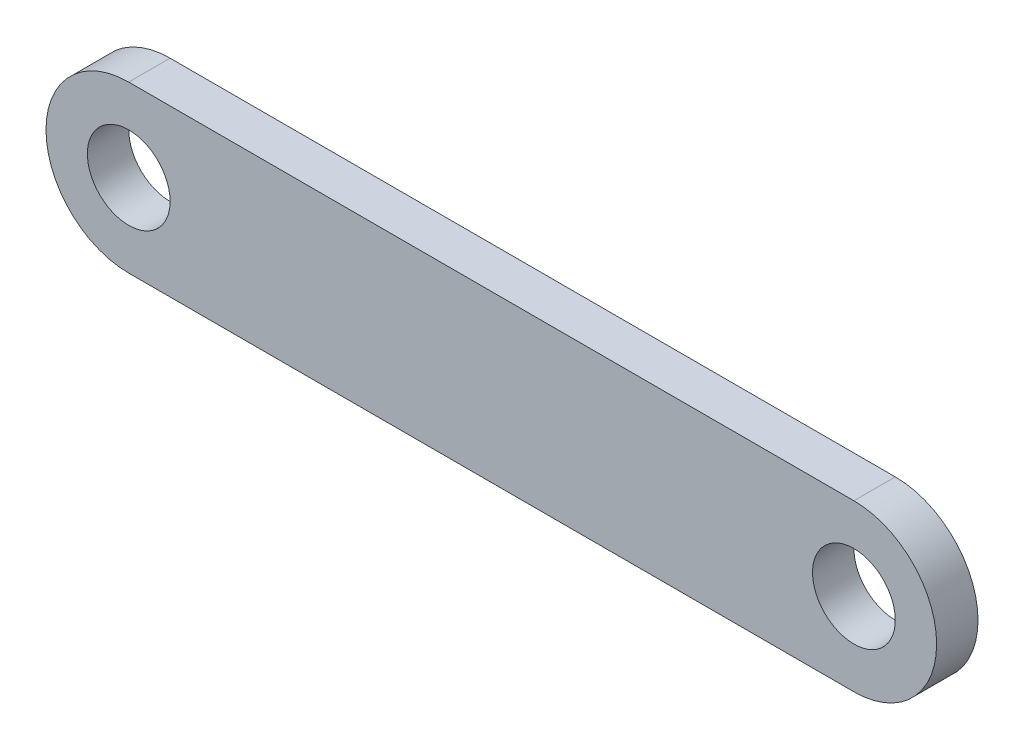
ISO-10303-21;
HEADER;
FILE_DESCRIPTION(('STEP AP214'),'2;1');
FILE_NAME('part.step','',(''),(''),'','','');
FILE_SCHEMA(('AUTOMOTIVE_DESIGN { 1 0 10303 214 1 1 1 1 }'));
ENDSEC;
DATA;
#1=APPLICATION_CONTEXT('core data for automotive mechanical design processes');
#2=APPLICATION_PROTOCOL_DEFINITION('international standard','automotive_design',2000,#1);
#3=PRODUCT_CONTEXT('',#1,'mechanical');
#4=PRODUCT('Part','Part','',(#3));
#5=PRODUCT_RELATED_PRODUCT_CATEGORY('part','',(#4));
#6=PRODUCT_DEFINITION_FORMATION('','',#4);
#7=PRODUCT_DEFINITION_CONTEXT('part definition',#1,'design');
#8=PRODUCT_DEFINITION('design','',#6,#7);
#9=PRODUCT_DEFINITION_SHAPE('','',#8);
#10=(LENGTH_UNIT() NAMED_UNIT(*) SI_UNIT(.MILLI.,.METRE.));
#11=(NAMED_UNIT(*) PLANE_ANGLE_UNIT() SI_UNIT($,.RADIAN.));
#12=(NAMED_UNIT(*) SI_UNIT($,.STERADIAN.) SOLID_ANGLE_UNIT());
#13=UNCERTAINTY_MEASURE_WITH_UNIT(LENGTH_MEASURE(1.E-05),#10,'distance_accuracy_value','');
#14=(GEOMETRIC_REPRESENTATION_CONTEXT(3) GLOBAL_UNCERTAINTY_ASSIGNED_CONTEXT((#13)) GLOBAL_UNIT_ASSIGNED_CONTEXT((#10,
#11,#12)) REPRESENTATION_CONTEXT('',''));
#15=CARTESIAN_POINT('',(0.,0.,0.));
#16=DIRECTION('',(0.,0.,1.));
#17=DIRECTION('',(1.,0.,0.));
#18=AXIS2_PLACEMENT_3D('',#15,#16,#17);
#19=CARTESIAN_POINT('',(0.,-2.,-1.));
#20=DIRECTION('',(0.,-1.,0.));
#21=DIRECTION('',(1.,0.,0.));
#22=AXIS2_PLACEMENT_3D('',#19,#20,#21);
#23=PLANE('',#22);
#24=DIRECTION('',(1.,0.,0.));
#25=VECTOR('',#24,1.);
#26=CARTESIAN_POINT('',(0.,-2.,0.));
#27=LINE('',#26,#25);
#28=CARTESIAN_POINT('',(0.,-2.,0.));
#29=VERTEX_POINT('',#28);
#30=CARTESIAN_POINT('',(17.53,-2.,0.));
#31=VERTEX_POINT('',#30);
#32=EDGE_CURVE('E107',#29,#31,#27,.T.);
#33=ORIENTED_EDGE('',*,*,#32,.F.);
#34=DIRECTION('',(0.,0.,1.));
#35=VECTOR('',#34,1.);
#36=CARTESIAN_POINT('',(0.,-2.,-1.));
#37=LINE('',#36,#35);
#38=CARTESIAN_POINT('',(0.,-2.,-1.));
#39=VERTEX_POINT('',#38);
#40=EDGE_CURVE('E11',#39,#29,#37,.T.);
#41=ORIENTED_EDGE('',*,*,#40,.F.);
#42=DIRECTION('',(1.,0.,0.));
#43=VECTOR('',#42,1.);
#44=CARTESIAN_POINT('',(0.,-2.,-1.));
#45=LINE('',#44,#43);
#46=CARTESIAN_POINT('',(17.53,-2.,-1.));
#47=VERTEX_POINT('',#46);
#48=EDGE_CURVE('E95',#39,#47,#45,.T.);
#49=ORIENTED_EDGE('',*,*,#48,.T.);
#50=DIRECTION('',(0.,0.,1.));
#51=VECTOR('',#50,1.);
#52=CARTESIAN_POINT('',(17.53,-2.,-1.));
#53=LINE('',#52,#51);
#54=EDGE_CURVE('E39',#47,#31,#53,.T.);
#55=ORIENTED_EDGE('',*,*,#54,.T.);
#56=EDGE_LOOP('',(#33,#41,#49,#55));
#57=FACE_BOUND('',#56,.T.);
#58=ADVANCED_FACE('F36',(#57),#23,.T.);
#59=CARTESIAN_POINT('',(0.,0.,-1.));
#60=DIRECTION('',(0.,0.,1.));
#61=DIRECTION('',(1.,0.,0.));
#62=AXIS2_PLACEMENT_3D('',#59,#60,#61);
#63=CYLINDRICAL_SURFACE('',#62,2.);
#64=CARTESIAN_POINT('',(0.,0.,0.));
#65=DIRECTION('',(0.,0.,1.));
#66=DIRECTION('',(1.,0.,0.));
#67=AXIS2_PLACEMENT_3D('',#64,#65,#66);
#68=CIRCLE('',#67,2.);
#69=CARTESIAN_POINT('',(0.,2.,0.));
#70=VERTEX_POINT('',#69);
#71=EDGE_CURVE('E113',#70,#29,#68,.T.);
#72=ORIENTED_EDGE('',*,*,#71,.F.);
#73=DIRECTION('',(0.,0.,1.));
#74=VECTOR('',#73,1.);
#75=CARTESIAN_POINT('',(0.,2.,-1.));
#76=LINE('',#75,#74);
#77=CARTESIAN_POINT('',(0.,2.,-1.));
#78=VERTEX_POINT('',#77);
#79=EDGE_CURVE('E45',#78,#70,#76,.T.);
#80=ORIENTED_EDGE('',*,*,#79,.F.);
#81=CARTESIAN_POINT('',(0.,0.,-1.));
#82=DIRECTION('',(0.,0.,1.));
#83=DIRECTION('',(1.,0.,0.));
#84=AXIS2_PLACEMENT_3D('',#81,#82,#83);
#85=CIRCLE('',#84,2.);
#86=EDGE_CURVE('E88',#78,#39,#85,.T.);
#87=ORIENTED_EDGE('',*,*,#86,.T.);
#88=ORIENTED_EDGE('',*,*,#40,.T.);
#89=EDGE_LOOP('',(#72,#80,#87,#88));
#90=FACE_BOUND('',#89,.T.);
#91=ADVANCED_FACE('F136',(#90),#63,.T.);
#92=CARTESIAN_POINT('',(0.,2.,-1.));
#93=DIRECTION('',(0.,-1.,0.));
#94=DIRECTION('',(1.,0.,0.));
#95=AXIS2_PLACEMENT_3D('',#92,#93,#94);
#96=PLANE('',#95);
#97=DIRECTION('',(1.,0.,0.));
#98=VECTOR('',#97,1.);
#99=CARTESIAN_POINT('',(0.,2.,0.));
#100=LINE('',#99,#98);
#101=CARTESIAN_POINT('',(17.53,2.,0.));
#102=VERTEX_POINT('',#101);
#103=EDGE_CURVE('E92',#70,#102,#100,.T.);
#104=ORIENTED_EDGE('',*,*,#103,.T.);
#105=DIRECTION('',(0.,0.,1.));
#106=VECTOR('',#105,1.);
#107=CARTESIAN_POINT('',(17.53,2.,-1.));
#108=LINE('',#107,#106);
#109=CARTESIAN_POINT('',(17.53,2.,-1.));
#110=VERTEX_POINT('',#109);
#111=EDGE_CURVE('E90',#110,#102,#108,.T.);
#112=ORIENTED_EDGE('',*,*,#111,.F.);
#113=DIRECTION('',(1.,0.,0.));
#114=VECTOR('',#113,1.);
#115=CARTESIAN_POINT('',(0.,2.,-1.));
#116=LINE('',#115,#114);
#117=EDGE_CURVE('E83',#78,#110,#116,.T.);
#118=ORIENTED_EDGE('',*,*,#117,.F.);
#119=ORIENTED_EDGE('',*,*,#79,.T.);
#120=EDGE_LOOP('',(#104,#112,#118,#119));
#121=FACE_BOUND('',#120,.T.);
#122=ADVANCED_FACE('F91',(#121),#96,.F.);
#123=CARTESIAN_POINT('',(0.,0.,-1.));
#124=DIRECTION('',(0.,0.,1.));
#125=DIRECTION('',(1.,0.,0.));
#126=AXIS2_PLACEMENT_3D('',#123,#124,#125);
#127=CYLINDRICAL_SURFACE('',#126,1.);
#128=CARTESIAN_POINT('',(0.,0.,-1.));
#129=DIRECTION('',(0.,0.,1.));
#130=DIRECTION('',(1.,0.,0.));
#131=AXIS2_PLACEMENT_3D('',#128,#129,#130);
#132=CIRCLE('',#131,1.);
#133=CARTESIAN_POINT('',(1.,0.,-1.));
#134=VERTEX_POINT('',#133);
#135=EDGE_CURVE('E101',#134,#134,#132,.T.);
#136=ORIENTED_EDGE('',*,*,#135,.F.);
#137=EDGE_LOOP('',(#136));
#138=FACE_BOUND('',#137,.T.);
#139=CARTESIAN_POINT('',(0.,0.,0.));
#140=DIRECTION('',(0.,0.,1.));
#141=DIRECTION('',(1.,0.,0.));
#142=AXIS2_PLACEMENT_3D('',#139,#140,#141);
#143=CIRCLE('',#142,1.);
#144=CARTESIAN_POINT('',(1.,0.,0.));
#145=VERTEX_POINT('',#144);
#146=EDGE_CURVE('E116',#145,#145,#143,.T.);
#147=ORIENTED_EDGE('',*,*,#146,.T.);
#148=EDGE_LOOP('',(#147));
#149=FACE_BOUND('',#148,.T.);
#150=ADVANCED_FACE('F144',(#138,#149),#127,.F.);
#151=CARTESIAN_POINT('',(17.53,0.,-1.));
#152=DIRECTION('',(0.,0.,1.));
#153=DIRECTION('',(1.,0.,0.));
#154=AXIS2_PLACEMENT_3D('',#151,#152,#153);
#155=CYLINDRICAL_SURFACE('',#154,2.);
#156=CARTESIAN_POINT('',(17.53,0.,0.));
#157=DIRECTION('',(0.,0.,1.));
#158=DIRECTION('',(1.,0.,0.));
#159=AXIS2_PLACEMENT_3D('',#156,#157,#158);
#160=CIRCLE('',#159,2.);
#161=EDGE_CURVE('E110',#31,#102,#160,.T.);
#162=ORIENTED_EDGE('',*,*,#161,.F.);
#163=ORIENTED_EDGE('',*,*,#54,.F.);
#164=CARTESIAN_POINT('',(17.53,0.,-1.));
#165=DIRECTION('',(0.,0.,1.));
#166=DIRECTION('',(1.,0.,0.));
#167=AXIS2_PLACEMENT_3D('',#164,#165,#166);
#168=CIRCLE('',#167,2.);
#169=EDGE_CURVE('E87',#47,#110,#168,.T.);
#170=ORIENTED_EDGE('',*,*,#169,.T.);
#171=ORIENTED_EDGE('',*,*,#111,.T.);
#172=EDGE_LOOP('',(#162,#163,#170,#171));
#173=FACE_BOUND('',#172,.T.);
#174=ADVANCED_FACE('F94',(#173),#155,.T.);
#175=CARTESIAN_POINT('',(17.53,0.,-1.));
#176=DIRECTION('',(0.,0.,1.));
#177=DIRECTION('',(1.,0.,0.));
#178=AXIS2_PLACEMENT_3D('',#175,#176,#177);
#179=CYLINDRICAL_SURFACE('',#178,0.999999999999998);
#180=CARTESIAN_POINT('',(17.53,0.,-1.));
#181=DIRECTION('',(0.,0.,1.));
#182=DIRECTION('',(1.,0.,0.));
#183=AXIS2_PLACEMENT_3D('',#180,#181,#182);
#184=CIRCLE('',#183,0.999999999999998);
#185=CARTESIAN_POINT('',(18.53,0.,-1.));
#186=VERTEX_POINT('',#185);
#187=EDGE_CURVE('E104',#186,#186,#184,.T.);
#188=ORIENTED_EDGE('',*,*,#187,.F.);
#189=EDGE_LOOP('',(#188));
#190=FACE_BOUND('',#189,.T.);
#191=CARTESIAN_POINT('',(17.53,0.,0.));
#192=DIRECTION('',(0.,0.,1.));
#193=DIRECTION('',(1.,0.,0.));
#194=AXIS2_PLACEMENT_3D('',#191,#192,#193);
#195=CIRCLE('',#194,0.999999999999998);
#196=CARTESIAN_POINT('',(18.53,0.,0.));
#197=VERTEX_POINT('',#196);
#198=EDGE_CURVE('E97',#197,#197,#195,.T.);
#199=ORIENTED_EDGE('',*,*,#198,.T.);
#200=EDGE_LOOP('',(#199));
#201=FACE_BOUND('',#200,.T.);
#202=ADVANCED_FACE('F123',(#190,#201),#179,.F.);
#203=CARTESIAN_POINT('',(0.,0.,-1.));
#204=DIRECTION('',(0.,0.,1.));
#205=DIRECTION('',(1.,0.,0.));
#206=AXIS2_PLACEMENT_3D('',#203,#204,#205);
#207=PLANE('',#206);
#208=ORIENTED_EDGE('',*,*,#48,.F.);
#209=ORIENTED_EDGE('',*,*,#86,.F.);
#210=ORIENTED_EDGE('',*,*,#117,.T.);
#211=ORIENTED_EDGE('',*,*,#169,.F.);
#212=EDGE_LOOP('',(#208,#209,#210,#211));
#213=FACE_BOUND('',#212,.T.);
#214=ORIENTED_EDGE('',*,*,#135,.T.);
#215=EDGE_LOOP('',(#214));
#216=FACE_BOUND('',#215,.T.);
#217=ORIENTED_EDGE('',*,*,#187,.T.);
#218=EDGE_LOOP('',(#217));
#219=FACE_BOUND('',#218,.T.);
#220=ADVANCED_FACE('F85',(#213,#216,#219),#207,.F.);
#221=CARTESIAN_POINT('',(0.,0.,0.));
#222=DIRECTION('',(0.,0.,1.));
#223=DIRECTION('',(1.,0.,0.));
#224=AXIS2_PLACEMENT_3D('',#221,#222,#223);
#225=PLANE('',#224);
#226=ORIENTED_EDGE('',*,*,#32,.T.);
#227=ORIENTED_EDGE('',*,*,#161,.T.);
#228=ORIENTED_EDGE('',*,*,#103,.F.);
#229=ORIENTED_EDGE('',*,*,#71,.T.);
#230=EDGE_LOOP('',(#226,#227,#228,#229));
#231=FACE_BOUND('',#230,.T.);
#232=ORIENTED_EDGE('',*,*,#146,.F.);
#233=EDGE_LOOP('',(#232));
#234=FACE_BOUND('',#233,.T.);
#235=ORIENTED_EDGE('',*,*,#198,.F.);
#236=EDGE_LOOP('',(#235));
#237=FACE_BOUND('',#236,.T.);
#238=ADVANCED_FACE('F125',(#231,#234,#237),#225,.T.);
#239=CLOSED_SHELL('',(#58,#91,#122,#150,#174,#202,#220,#238));
#240=MANIFOLD_SOLID_BREP('B2',#239);
#241=ADVANCED_BREP_SHAPE_REPRESENTATION('',(#18,#240),#14);
#242=SHAPE_DEFINITION_REPRESENTATION(#9,#241);
ENDSEC;
END-ISO-10303-21;
